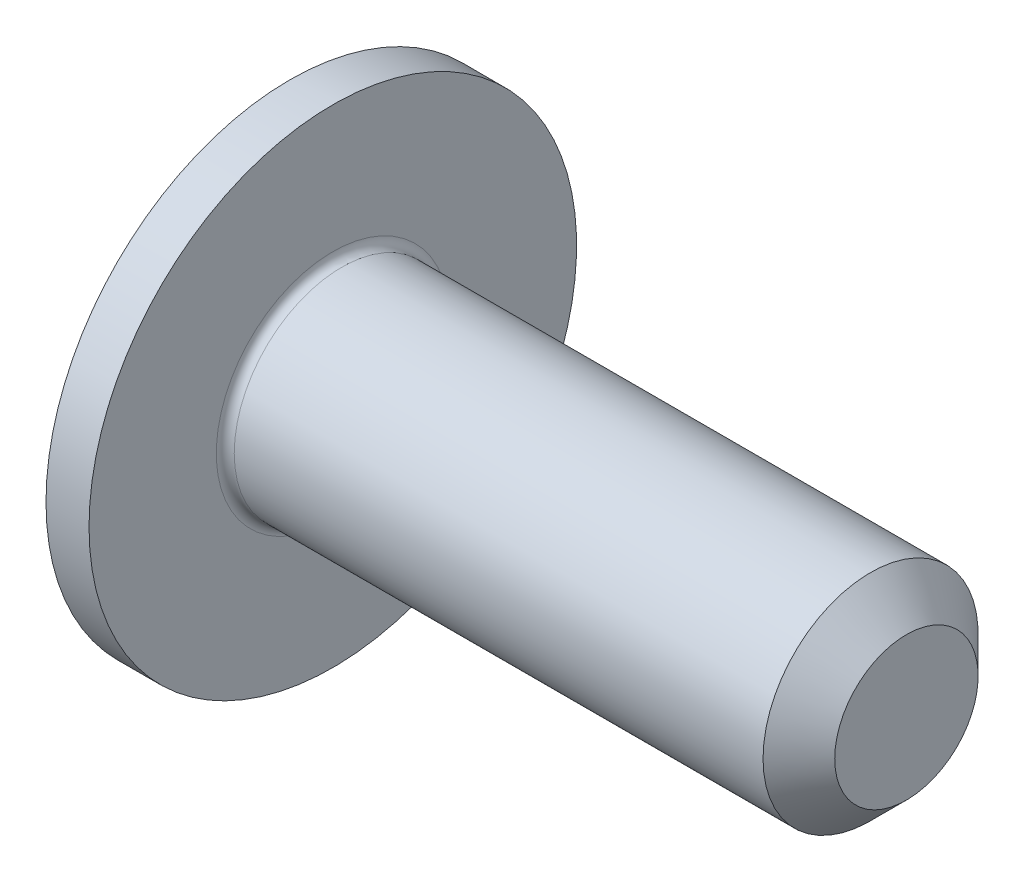
ISO-10303-21;
HEADER;
FILE_DESCRIPTION(('STEP AP214'),'2;1');
FILE_NAME('part.step','',(''),(''),'','','');
FILE_SCHEMA(('AUTOMOTIVE_DESIGN { 1 0 10303 214 1 1 1 1 }'));
ENDSEC;
DATA;
#1=APPLICATION_CONTEXT('core data for automotive mechanical design processes');
#2=APPLICATION_PROTOCOL_DEFINITION('international standard','automotive_design',2000,#1);
#3=PRODUCT_CONTEXT('',#1,'mechanical');
#4=PRODUCT('Part','Part','',(#3));
#5=PRODUCT_RELATED_PRODUCT_CATEGORY('part','',(#4));
#6=PRODUCT_DEFINITION_FORMATION('','',#4);
#7=PRODUCT_DEFINITION_CONTEXT('part definition',#1,'design');
#8=PRODUCT_DEFINITION('design','',#6,#7);
#9=PRODUCT_DEFINITION_SHAPE('','',#8);
#10=(LENGTH_UNIT() NAMED_UNIT(*) SI_UNIT(.MILLI.,.METRE.));
#11=(NAMED_UNIT(*) PLANE_ANGLE_UNIT() SI_UNIT($,.RADIAN.));
#12=(NAMED_UNIT(*) SI_UNIT($,.STERADIAN.) SOLID_ANGLE_UNIT());
#13=UNCERTAINTY_MEASURE_WITH_UNIT(LENGTH_MEASURE(1.E-05),#10,'distance_accuracy_value','');
#14=(GEOMETRIC_REPRESENTATION_CONTEXT(3) GLOBAL_UNCERTAINTY_ASSIGNED_CONTEXT((#13)) GLOBAL_UNIT_ASSIGNED_CONTEXT((#10,
#11,#12)) REPRESENTATION_CONTEXT('',''));
#15=CARTESIAN_POINT('',(0.,0.,0.));
#16=DIRECTION('',(0.,0.,1.));
#17=DIRECTION('',(1.,0.,0.));
#18=AXIS2_PLACEMENT_3D('',#15,#16,#17);
#19=CARTESIAN_POINT('',(-2.8905989232415,0.,0.));
#20=DIRECTION('',(-1.,0.,0.));
#21=DIRECTION('',(0.,-1.,0.));
#22=AXIS2_PLACEMENT_3D('',#19,#20,#21);
#23=CONICAL_SURFACE('',#22,1.9,0.78539816339745);
#24=CARTESIAN_POINT('',(-3.3,0.,0.));
#25=DIRECTION('',(1.,0.,0.));
#26=DIRECTION('',(0.,0.,-1.));
#27=AXIS2_PLACEMENT_3D('',#24,#25,#26);
#28=CIRCLE('',#27,2.30940107675851);
#29=CARTESIAN_POINT('',(-3.3,-1.15470053837925,2.));
#30=VERTEX_POINT('',#29);
#31=CARTESIAN_POINT('',(-3.3,1.15470053837925,2.));
#32=VERTEX_POINT('',#31);
#33=EDGE_CURVE('E129',#30,#32,#28,.F.);
#34=ORIENTED_EDGE('',*,*,#33,.T.);
#35=CARTESIAN_POINT('',(-4.09139546270494,-2.36958628860577,2.));
#36=CARTESIAN_POINT('',(-4.04753622473497,-2.31217995018499,2.));
#37=CARTESIAN_POINT('',(-4.00408122115932,-2.25445977428987,2.));
#38=CARTESIAN_POINT('',(-3.91816300030033,-2.13826512497911,2.));
#39=CARTESIAN_POINT('',(-3.8757000254471,-2.07979047249494,2.));
#40=CARTESIAN_POINT('',(-3.79164695493216,-1.96153258115476,2.));
#41=CARTESIAN_POINT('',(-3.75006614444884,-1.90174272081428,2.));
#42=CARTESIAN_POINT('',(-3.66838969754884,-1.78116027955478,2.));
#43=CARTESIAN_POINT('',(-3.62829395794447,-1.72036776872909,2.));
#44=CARTESIAN_POINT('',(-3.54753127039677,-1.59386851169317,2.));
#45=CARTESIAN_POINT('',(-3.50697882394963,-1.52808829237943,2.));
#46=CARTESIAN_POINT('',(-3.42844521224915,-1.39498494304244,2.));
#47=CARTESIAN_POINT('',(-3.39046451313341,-1.32766153625564,2.));
#48=CARTESIAN_POINT('',(-3.31789058124773,-1.19146840795352,2.));
#49=CARTESIAN_POINT('',(-3.28328717373968,-1.12260415104552,2.));
#50=CARTESIAN_POINT('',(-3.21823576198416,-0.98294540053103,2.));
#51=CARTESIAN_POINT('',(-3.1877863377699,-0.912151576491871,2.));
#52=CARTESIAN_POINT('',(-3.13470862693174,-0.775123898075358,2.));
#53=CARTESIAN_POINT('',(-3.11161821302263,-0.709070898878943,2.));
#54=CARTESIAN_POINT('',(-3.07072836087579,-0.57531636082436,2.));
#55=CARTESIAN_POINT('',(-3.05292926929899,-0.507614714269312,2.));
#56=CARTESIAN_POINT('',(-3.02386891779143,-0.372126099199313,2.));
#57=CARTESIAN_POINT('',(-3.01249145846734,-0.30436447489191,2.));
#58=CARTESIAN_POINT('',(-2.99650589610828,-0.168043060826933,2.));
#59=CARTESIAN_POINT('',(-2.9918964828145,-0.0994834281507621,2.));
#60=CARTESIAN_POINT('',(-2.98982099591548,0.0349465055204236,2.));
#61=CARTESIAN_POINT('',(-2.99207135666175,0.10081249405253,2.));
#62=CARTESIAN_POINT('',(-3.00294912150633,0.232011962848072,2.));
#63=CARTESIAN_POINT('',(-3.01157712076579,0.297345392837821,2.));
#64=CARTESIAN_POINT('',(-3.03487473973461,0.428114238541738,2.));
#65=CARTESIAN_POINT('',(-3.04964956795893,0.493530613367338,2.));
#66=CARTESIAN_POINT('',(-3.08443560559547,0.622925007752622,2.));
#67=CARTESIAN_POINT('',(-3.10444646376339,0.686903123481368,2.));
#68=CARTESIAN_POINT('',(-3.17413808633665,0.885397419031998,2.));
#69=CARTESIAN_POINT('',(-3.23163223537918,1.01716121743681,2.));
#70=CARTESIAN_POINT('',(-3.35953993784174,1.27453329373169,2.));
#71=CARTESIAN_POINT('',(-3.42999932548452,1.40011766460675,2.));
#72=CARTESIAN_POINT('',(-3.54000779674126,1.58164926221535,2.));
#73=CARTESIAN_POINT('',(-3.57637808227548,1.63956153116599,2.));
#74=CARTESIAN_POINT('',(-3.65066754107572,1.75439175369841,2.));
#75=CARTESIAN_POINT('',(-3.68858683090634,1.81130963198916,2.));
#76=CARTESIAN_POINT('',(-3.76538049862992,1.92382168036666,2.));
#77=CARTESIAN_POINT('',(-3.80424471276877,1.97942282256591,2.));
#78=CARTESIAN_POINT('',(-3.88301037735981,2.08986326693597,2.));
#79=CARTESIAN_POINT('',(-3.92291153911414,2.14470277476629,2.));
#80=CARTESIAN_POINT('',(-3.96323780620038,2.1992230283623,2.));
#81=B_SPLINE_CURVE_WITH_KNOTS('',3,(#35,#36,#37,#38,#39,#40,#41,#42,#43,#44,#45,#46,#47,#48,#49,
#50,#51,#52,#53,#54,#55,#56,#57,#58,#59,#60,#61,#62,#63,#64,#65,#66,#67,#68,#69,#70,#71,#72,#73,
#74,#75,#76,#77,#78,#79,#80),.UNSPECIFIED.,.F.,.F.,(4,2,2,2,2,2,2,2,2,2,2,2,2,2,2,2,2,2,2,2,2,2,
4),(0.,0.216734531943993,0.433521486450841,0.651984280142148,0.870431865722611,1.1022122830784,
1.33403459955483,1.5651354284366,1.79615706051622,2.00589271816808,2.21564211362268,
2.42146326167461,2.62724455855777,2.82463635194274,3.022046568254,3.22298450499512,
3.42390896583498,3.85394015124757,4.2855218386168,4.49066009458343,4.69581381601344,
4.89931368794884,5.10275749769567),.UNSPECIFIED.);
#82=EDGE_CURVE('E11',#32,#30,#81,.F.);
#83=ORIENTED_EDGE('',*,*,#82,.T.);
#84=EDGE_LOOP('',(#34,#83));
#85=FACE_BOUND('',#84,.T.);
#86=ADVANCED_FACE('F16',(#85),#23,.F.);
#87=CARTESIAN_POINT('',(-3.3,0.,0.));
#88=DIRECTION('',(-1.,0.,0.));
#89=DIRECTION('',(0.,-1.,0.));
#90=AXIS2_PLACEMENT_3D('',#87,#88,#89);
#91=CIRCLE('',#90,2.30940107675851);
#92=CARTESIAN_POINT('',(-3.3,-2.30940107675851,0.));
#93=VERTEX_POINT('',#92);
#94=EDGE_CURVE('E107',#93,#30,#91,.T.);
#95=ORIENTED_EDGE('',*,*,#94,.T.);
#96=CARTESIAN_POINT('',(-3.30011547871366,-1.15458506832541,2.0002));
#97=CARTESIAN_POINT('',(-3.26045309022559,-1.19427965103065,1.93144696596929));
#98=CARTESIAN_POINT('',(-3.22311998228416,-1.23463799837204,1.86154425786449));
#99=CARTESIAN_POINT('',(-3.15476368513614,-1.31693321846145,1.71900475544956));
#100=CARTESIAN_POINT('',(-3.12377853373722,-1.35887791933134,1.64635440243464));
#101=CARTESIAN_POINT('',(-3.07070021654414,-1.44345742638069,1.49985839894603));
#102=CARTESIAN_POINT('',(-3.04847362717661,-1.48607068799507,1.4260500647537));
#103=CARTESIAN_POINT('',(-3.01422881667508,-1.57223542169503,1.27680836816474));
#104=CARTESIAN_POINT('',(-3.00218502914413,-1.61578426088223,1.20137956608185));
#105=CARTESIAN_POINT('',(-2.99131851190557,-1.69083694766536,1.07138449932892));
#106=CARTESIAN_POINT('',(-2.98970975360997,-1.72224381117151,1.01698621602989));
#107=CARTESIAN_POINT('',(-2.99241887759871,-1.78500621460364,0.908278544480307));
#108=CARTESIAN_POINT('',(-2.99673883775798,-1.81636173267754,0.853969194078661));
#109=CARTESIAN_POINT('',(-3.01105956740991,-1.87877671565355,0.745863272410663));
#110=CARTESIAN_POINT('',(-3.02106669276201,-1.90983580972306,0.692067343445209));
#111=CARTESIAN_POINT('',(-3.04621243024966,-1.97141691651547,0.585405737694428));
#112=CARTESIAN_POINT('',(-3.06135064904224,-2.00193897021859,0.532539989929288));
#113=CARTESIAN_POINT('',(-3.10629450342919,-2.08012358375727,0.397120266910156));
#114=CARTESIAN_POINT('',(-3.13948883942582,-2.12730124240478,0.315406165150523));
#115=CARTESIAN_POINT('',(-3.19552582317137,-2.19667172615922,0.195252962742199));
#116=CARTESIAN_POINT('',(-3.21521470294694,-2.21953238052245,0.155657147890824));
#117=CARTESIAN_POINT('',(-3.25638731836487,-2.26483018959124,0.0771990411121278));
#118=CARTESIAN_POINT('',(-3.27786995165125,-2.28726759416161,0.0383363164062594));
#119=CARTESIAN_POINT('',(-3.30011547871366,-2.30951654681234,-0.000200000000000407));
#120=B_SPLINE_CURVE_WITH_KNOTS('',3,(#96,#97,#98,#99,#100,#101,#102,#103,#104,#105,#106,#107,
#108,#109,#110,#111,#112,#113,#114,#115,#116,#117,#118,#119),.UNSPECIFIED.,.F.,.F.,(4,2,2,2,2,2,
2,2,2,2,2,4),(0.,0.266420613771064,0.534393751523389,0.798110374376915,1.06116288956936,
1.24939906803722,1.43770123566247,1.62621426093931,1.81471283831913,2.11415604834145,
2.2634717071779,2.41269626969771),.UNSPECIFIED.);
#121=EDGE_CURVE('E30',#30,#93,#120,.T.);
#122=ORIENTED_EDGE('',*,*,#121,.T.);
#123=EDGE_LOOP('',(#95,#122));
#124=FACE_BOUND('',#123,.T.);
#125=ADVANCED_FACE('F209',(#124),#23,.F.);
#126=CARTESIAN_POINT('',(-3.3,-1.15470053837925,-2.));
#127=VERTEX_POINT('',#126);
#128=EDGE_CURVE('E128',#127,#93,#28,.F.);
#129=ORIENTED_EDGE('',*,*,#128,.T.);
#130=CARTESIAN_POINT('',(-3.30011547871366,-2.30951654681234,0.000199999999999596));
#131=CARTESIAN_POINT('',(-3.26045309022559,-2.26982196410711,-0.0685530340307072));
#132=CARTESIAN_POINT('',(-3.22311998228416,-2.22946361676572,-0.138455742135513));
#133=CARTESIAN_POINT('',(-3.15476368513615,-2.14716839667631,-0.280995244550438));
#134=CARTESIAN_POINT('',(-3.12377853373722,-2.10522369580642,-0.35364559756536));
#135=CARTESIAN_POINT('',(-3.07070021654415,-2.02064418875706,-0.500141601053974));
#136=CARTESIAN_POINT('',(-3.04847362717662,-1.97803092714269,-0.573949935246298));
#137=CARTESIAN_POINT('',(-3.01422881667508,-1.89186619344273,-0.723191631835266));
#138=CARTESIAN_POINT('',(-3.00218502914413,-1.84831735425552,-0.798620433918151));
#139=CARTESIAN_POINT('',(-2.99131851190557,-1.7732646674724,-0.928615500671079));
#140=CARTESIAN_POINT('',(-2.98970975360997,-1.74185780396625,-0.98301378397011));
#141=CARTESIAN_POINT('',(-2.99241887759872,-1.67909540053412,-1.0917214555197));
#142=CARTESIAN_POINT('',(-2.99673883775798,-1.64773988246022,-1.14603080592134));
#143=CARTESIAN_POINT('',(-3.01105956740991,-1.5853248994842,-1.25413672758934));
#144=CARTESIAN_POINT('',(-3.02106669276201,-1.55426580541469,-1.30793265655479));
#145=CARTESIAN_POINT('',(-3.04621243024966,-1.49268469862228,-1.41459426230557));
#146=CARTESIAN_POINT('',(-3.06135064904224,-1.46216264491917,-1.46746001007071));
#147=CARTESIAN_POINT('',(-3.10629450342919,-1.38397803138049,-1.60287973308984));
#148=CARTESIAN_POINT('',(-3.13948883942582,-1.33680037273297,-1.68459383484948));
#149=CARTESIAN_POINT('',(-3.19552582317137,-1.26742988897853,-1.8047470372578));
#150=CARTESIAN_POINT('',(-3.21521470294694,-1.24456923461531,-1.84434285210918));
#151=CARTESIAN_POINT('',(-3.25638731836487,-1.19927142554652,-1.92280095888787));
#152=CARTESIAN_POINT('',(-3.27786995165125,-1.17683402097615,-1.96166368359374));
#153=CARTESIAN_POINT('',(-3.30011547871366,-1.15458506832541,-2.0002));
#154=B_SPLINE_CURVE_WITH_KNOTS('',3,(#130,#131,#132,#133,#134,#135,#136,#137,#138,#139,#140,
#141,#142,#143,#144,#145,#146,#147,#148,#149,#150,#151,#152,#153),.UNSPECIFIED.,.F.,.F.,(4,2,2,
2,2,2,2,2,2,2,2,4),(0.,0.266420613771062,0.534393751523388,0.798110374376914,1.06116288956936,
1.24939906803722,1.43770123566247,1.62621426093931,1.81471283831913,2.11415604834144,
2.2634717071779,2.41269626969771),.UNSPECIFIED.);
#155=EDGE_CURVE('E178',#93,#127,#154,.T.);
#156=ORIENTED_EDGE('',*,*,#155,.T.);
#157=EDGE_LOOP('',(#129,#156));
#158=FACE_BOUND('',#157,.T.);
#159=ADVANCED_FACE('F216',(#158),#23,.F.);
#160=CARTESIAN_POINT('',(-3.3,1.15470053837925,-2.));
#161=VERTEX_POINT('',#160);
#162=EDGE_CURVE('E238',#161,#127,#28,.F.);
#163=ORIENTED_EDGE('',*,*,#162,.T.);
#164=CARTESIAN_POINT('',(-4.09139546270494,-2.36958628860577,-2.));
#165=CARTESIAN_POINT('',(-4.04753622473497,-2.31217995018499,-2.));
#166=CARTESIAN_POINT('',(-4.00408122115932,-2.25445977428987,-2.));
#167=CARTESIAN_POINT('',(-3.91816300030033,-2.13826512497911,-2.));
#168=CARTESIAN_POINT('',(-3.8757000254471,-2.07979047249494,-2.));
#169=CARTESIAN_POINT('',(-3.79164695493216,-1.96153258115476,-2.));
#170=CARTESIAN_POINT('',(-3.75006614444884,-1.90174272081428,-2.));
#171=CARTESIAN_POINT('',(-3.66838969754884,-1.78116027955478,-2.));
#172=CARTESIAN_POINT('',(-3.62829395794447,-1.72036776872909,-2.));
#173=CARTESIAN_POINT('',(-3.54753127039676,-1.59386851169317,-2.));
#174=CARTESIAN_POINT('',(-3.50697882394963,-1.52808829237943,-2.));
#175=CARTESIAN_POINT('',(-3.42844521224915,-1.39498494304244,-2.));
#176=CARTESIAN_POINT('',(-3.39046451313341,-1.32766153625564,-2.));
#177=CARTESIAN_POINT('',(-3.31789058124773,-1.19146840795352,-2.));
#178=CARTESIAN_POINT('',(-3.28328717373967,-1.12260415104552,-2.));
#179=CARTESIAN_POINT('',(-3.21823576198416,-0.982945400531028,-2.));
#180=CARTESIAN_POINT('',(-3.1877863377699,-0.912151576491869,-2.));
#181=CARTESIAN_POINT('',(-3.13470862693174,-0.775123898075356,-2.));
#182=CARTESIAN_POINT('',(-3.11161821302263,-0.709070898878941,-2.));
#183=CARTESIAN_POINT('',(-3.07072836087579,-0.575316360824358,-2.));
#184=CARTESIAN_POINT('',(-3.05292926929899,-0.507614714269311,-2.));
#185=CARTESIAN_POINT('',(-3.02386891779143,-0.372126099199312,-2.));
#186=CARTESIAN_POINT('',(-3.01249145846734,-0.304364474891909,-2.));
#187=CARTESIAN_POINT('',(-2.99650589610828,-0.168043060826932,-2.));
#188=CARTESIAN_POINT('',(-2.9918964828145,-0.0994834281507614,-2.));
#189=CARTESIAN_POINT('',(-2.98982099591548,0.0349465055204243,-2.));
#190=CARTESIAN_POINT('',(-2.99207135666175,0.100812494052531,-2.));
#191=CARTESIAN_POINT('',(-3.00294912150633,0.232011962848073,-2.));
#192=CARTESIAN_POINT('',(-3.01157712076579,0.297345392837822,-2.));
#193=CARTESIAN_POINT('',(-3.03487473973461,0.428114238541739,-2.));
#194=CARTESIAN_POINT('',(-3.04964956795893,0.493530613367338,-2.));
#195=CARTESIAN_POINT('',(-3.08443560559547,0.622925007752622,-2.));
#196=CARTESIAN_POINT('',(-3.10444646376339,0.686903123481368,-2.));
#197=CARTESIAN_POINT('',(-3.17413808633665,0.885397419031998,-2.));
#198=CARTESIAN_POINT('',(-3.23163223537918,1.01716121743681,-2.));
#199=CARTESIAN_POINT('',(-3.35953993784174,1.27453329373169,-2.));
#200=CARTESIAN_POINT('',(-3.42999932548452,1.40011766460675,-2.));
#201=CARTESIAN_POINT('',(-3.54000779674126,1.58164926221535,-2.));
#202=CARTESIAN_POINT('',(-3.57637808227548,1.63956153116599,-2.));
#203=CARTESIAN_POINT('',(-3.65066754107572,1.75439175369842,-2.));
#204=CARTESIAN_POINT('',(-3.68858683090634,1.81130963198916,-2.));
#205=CARTESIAN_POINT('',(-3.76538049862992,1.92382168036666,-2.));
#206=CARTESIAN_POINT('',(-3.80424471276877,1.97942282256591,-2.));
#207=CARTESIAN_POINT('',(-3.88301037735981,2.08986326693597,-2.));
#208=CARTESIAN_POINT('',(-3.92291153911414,2.14470277476629,-2.));
#209=CARTESIAN_POINT('',(-3.96323780620038,2.1992230283623,-2.));
#210=B_SPLINE_CURVE_WITH_KNOTS('',3,(#164,#165,#166,#167,#168,#169,#170,#171,#172,#173,#174,
#175,#176,#177,#178,#179,#180,#181,#182,#183,#184,#185,#186,#187,#188,#189,#190,#191,#192,#193,
#194,#195,#196,#197,#198,#199,#200,#201,#202,#203,#204,#205,#206,#207,#208,#209),.UNSPECIFIED.,
.F.,.F.,(4,2,2,2,2,2,2,2,2,2,2,2,2,2,2,2,2,2,2,2,2,2,4),(0.,0.216734531943993,0.433521486450841,
0.651984280142147,0.870431865722611,1.1022122830784,1.33403459955483,1.5651354284366,
1.79615706051622,2.00589271816808,2.21564211362268,2.42146326167461,2.62724455855777,
2.82463635194274,3.022046568254,3.22298450499512,3.42390896583498,3.85394015124757,
4.2855218386168,4.49066009458343,4.69581381601344,4.89931368794883,5.10275749769567),.UNSPECIFIED.);
#211=EDGE_CURVE('E171',#127,#161,#210,.T.);
#212=ORIENTED_EDGE('',*,*,#211,.T.);
#213=EDGE_LOOP('',(#163,#212));
#214=FACE_BOUND('',#213,.T.);
#215=ADVANCED_FACE('F230',(#214),#23,.F.);
#216=CARTESIAN_POINT('',(-3.3,2.30940107675851,0.));
#217=VERTEX_POINT('',#216);
#218=EDGE_CURVE('E236',#217,#161,#28,.F.);
#219=ORIENTED_EDGE('',*,*,#218,.T.);
#220=CARTESIAN_POINT('',(-3.30011547871366,1.15458506832541,-2.0002));
#221=CARTESIAN_POINT('',(-3.26045309022559,1.19427965103065,-1.93144696596929));
#222=CARTESIAN_POINT('',(-3.22311998228416,1.23463799837204,-1.86154425786449));
#223=CARTESIAN_POINT('',(-3.15476368513615,1.31693321846145,-1.71900475544956));
#224=CARTESIAN_POINT('',(-3.12377853373722,1.35887791933134,-1.64635440243464));
#225=CARTESIAN_POINT('',(-3.07070021654414,1.44345742638069,-1.49985839894603));
#226=CARTESIAN_POINT('',(-3.04847362717661,1.48607068799507,-1.4260500647537));
#227=CARTESIAN_POINT('',(-3.01422881667508,1.57223542169503,-1.27680836816473));
#228=CARTESIAN_POINT('',(-3.00218502914414,1.61578426088223,-1.20137956608185));
#229=CARTESIAN_POINT('',(-2.99131851190557,1.69083694766536,-1.07138449932892));
#230=CARTESIAN_POINT('',(-2.98970975360997,1.72224381117151,-1.01698621602989));
#231=CARTESIAN_POINT('',(-2.99241887759871,1.78500621460364,-0.908278544480306));
#232=CARTESIAN_POINT('',(-2.99673883775798,1.81636173267754,-0.853969194078661));
#233=CARTESIAN_POINT('',(-3.01105956740991,1.87877671565355,-0.745863272410663));
#234=CARTESIAN_POINT('',(-3.02106669276201,1.90983580972306,-0.692067343445209));
#235=CARTESIAN_POINT('',(-3.04621243024966,1.97141691651547,-0.585405737694428));
#236=CARTESIAN_POINT('',(-3.06135064904224,2.00193897021859,-0.532539989929288));
#237=CARTESIAN_POINT('',(-3.10629450342919,2.08012358375727,-0.397120266910156));
#238=CARTESIAN_POINT('',(-3.13948883942582,2.12730124240478,-0.315406165150523));
#239=CARTESIAN_POINT('',(-3.19552582317137,2.19667172615922,-0.195252962742199));
#240=CARTESIAN_POINT('',(-3.21521470294694,2.21953238052245,-0.155657147890824));
#241=CARTESIAN_POINT('',(-3.25638731836487,2.26483018959123,-0.0771990411121282));
#242=CARTESIAN_POINT('',(-3.27786995165125,2.28726759416161,-0.0383363164062597));
#243=CARTESIAN_POINT('',(-3.30011547871366,2.30951654681234,0.000200000000000379));
#244=B_SPLINE_CURVE_WITH_KNOTS('',3,(#220,#221,#222,#223,#224,#225,#226,#227,#228,#229,#230,
#231,#232,#233,#234,#235,#236,#237,#238,#239,#240,#241,#242,#243),.UNSPECIFIED.,.F.,.F.,(4,2,2,
2,2,2,2,2,2,2,2,4),(0.,0.266420613771063,0.534393751523388,0.798110374376915,1.06116288956936,
1.24939906803722,1.43770123566247,1.62621426093931,1.81471283831913,2.11415604834144,
2.2634717071779,2.41269626969771),.UNSPECIFIED.);
#245=EDGE_CURVE('E144',#161,#217,#244,.T.);
#246=ORIENTED_EDGE('',*,*,#245,.T.);
#247=EDGE_LOOP('',(#219,#246));
#248=FACE_BOUND('',#247,.T.);
#249=ADVANCED_FACE('F220',(#248),#23,.F.);
#250=EDGE_CURVE('E133',#32,#217,#28,.F.);
#251=ORIENTED_EDGE('',*,*,#250,.T.);
#252=CARTESIAN_POINT('',(-3.30011547871366,2.30951654681234,-0.000199999999999596));
#253=CARTESIAN_POINT('',(-3.26045309022559,2.26982196410711,0.0685530340307071));
#254=CARTESIAN_POINT('',(-3.22311998228416,2.22946361676572,0.138455742135513));
#255=CARTESIAN_POINT('',(-3.15476368513615,2.14716839667631,0.280995244550438));
#256=CARTESIAN_POINT('',(-3.12377853373722,2.10522369580642,0.35364559756536));
#257=CARTESIAN_POINT('',(-3.07070021654415,2.02064418875706,0.500141601053973));
#258=CARTESIAN_POINT('',(-3.04847362717661,1.97803092714269,0.573949935246297));
#259=CARTESIAN_POINT('',(-3.01422881667508,1.89186619344273,0.723191631835265));
#260=CARTESIAN_POINT('',(-3.00218502914414,1.84831735425552,0.798620433918151));
#261=CARTESIAN_POINT('',(-2.99131851190557,1.7732646674724,0.928615500671079));
#262=CARTESIAN_POINT('',(-2.98970975360997,1.74185780396625,0.98301378397011));
#263=CARTESIAN_POINT('',(-2.99241887759872,1.67909540053412,1.0917214555197));
#264=CARTESIAN_POINT('',(-2.99673883775798,1.64773988246022,1.14603080592134));
#265=CARTESIAN_POINT('',(-3.01105956740991,1.5853248994842,1.25413672758934));
#266=CARTESIAN_POINT('',(-3.02106669276201,1.55426580541469,1.30793265655479));
#267=CARTESIAN_POINT('',(-3.04621243024966,1.49268469862228,1.41459426230557));
#268=CARTESIAN_POINT('',(-3.06135064904224,1.46216264491917,1.46746001007071));
#269=CARTESIAN_POINT('',(-3.10629450342919,1.38397803138048,1.60287973308984));
#270=CARTESIAN_POINT('',(-3.13948883942582,1.33680037273297,1.68459383484948));
#271=CARTESIAN_POINT('',(-3.19552582317137,1.26742988897853,1.8047470372578));
#272=CARTESIAN_POINT('',(-3.21521470294694,1.24456923461531,1.84434285210918));
#273=CARTESIAN_POINT('',(-3.25638731836487,1.19927142554652,1.92280095888787));
#274=CARTESIAN_POINT('',(-3.27786995165125,1.17683402097614,1.96166368359374));
#275=CARTESIAN_POINT('',(-3.30011547871366,1.15458506832541,2.0002));
#276=B_SPLINE_CURVE_WITH_KNOTS('',3,(#252,#253,#254,#255,#256,#257,#258,#259,#260,#261,#262,
#263,#264,#265,#266,#267,#268,#269,#270,#271,#272,#273,#274,#275),.UNSPECIFIED.,.F.,.F.,(4,2,2,
2,2,2,2,2,2,2,2,4),(0.,0.266420613771062,0.534393751523386,0.798110374376913,1.06116288956936,
1.24939906803721,1.43770123566247,1.62621426093931,1.81471283831913,2.11415604834144,
2.2634717071779,2.41269626969771),.UNSPECIFIED.);
#277=EDGE_CURVE('E136',#217,#32,#276,.T.);
#278=ORIENTED_EDGE('',*,*,#277,.T.);
#279=EDGE_LOOP('',(#251,#278));
#280=FACE_BOUND('',#279,.T.);
#281=ADVANCED_FACE('F211',(#280),#23,.F.);
#282=CARTESIAN_POINT('',(0.,0.,3.));
#283=DIRECTION('',(-1.,0.,0.));
#284=DIRECTION('',(0.,0.,1.));
#285=AXIS2_PLACEMENT_3D('',#282,#283,#284);
#286=PLANE('',#285);
#287=CARTESIAN_POINT('',(0.,0.,0.));
#288=DIRECTION('',(-1.,0.,0.));
#289=DIRECTION('',(0.,0.,1.));
#290=AXIS2_PLACEMENT_3D('',#287,#288,#289);
#291=CIRCLE('',#290,6.8);
#292=CARTESIAN_POINT('',(0.,0.,6.8));
#293=VERTEX_POINT('',#292);
#294=EDGE_CURVE('E113',#293,#293,#291,.T.);
#295=ORIENTED_EDGE('',*,*,#294,.F.);
#296=EDGE_LOOP('',(#295));
#297=FACE_BOUND('',#296,.T.);
#298=CARTESIAN_POINT('',(0.,0.,0.));
#299=DIRECTION('',(1.,0.,0.));
#300=DIRECTION('',(0.,0.,-1.));
#301=AXIS2_PLACEMENT_3D('',#298,#299,#300);
#302=CIRCLE('',#301,3.25);
#303=CARTESIAN_POINT('',(0.,0.,-3.25));
#304=VERTEX_POINT('',#303);
#305=EDGE_CURVE('E132',#304,#304,#302,.T.);
#306=ORIENTED_EDGE('',*,*,#305,.F.);
#307=EDGE_LOOP('',(#306));
#308=FACE_BOUND('',#307,.T.);
#309=ADVANCED_FACE('F219',(#297,#308),#286,.F.);
#310=CARTESIAN_POINT('',(-3.3,0.,0.));
#311=DIRECTION('',(-1.,0.,0.));
#312=DIRECTION('',(0.,0.,1.));
#313=AXIS2_PLACEMENT_3D('',#310,#311,#312);
#314=CYLINDRICAL_SURFACE('',#313,6.8);
#315=ORIENTED_EDGE('',*,*,#294,.T.);
#316=EDGE_LOOP('',(#315));
#317=FACE_BOUND('',#316,.T.);
#318=CARTESIAN_POINT('',(-1.2,0.,0.));
#319=DIRECTION('',(1.,0.,0.));
#320=DIRECTION('',(0.,0.,-1.));
#321=AXIS2_PLACEMENT_3D('',#318,#319,#320);
#322=CIRCLE('',#321,6.8);
#323=CARTESIAN_POINT('',(-1.2,0.,-6.8));
#324=VERTEX_POINT('',#323);
#325=EDGE_CURVE('E125',#324,#324,#322,.T.);
#326=ORIENTED_EDGE('',*,*,#325,.T.);
#327=EDGE_LOOP('',(#326));
#328=FACE_BOUND('',#327,.T.);
#329=ADVANCED_FACE('F227',(#317,#328),#314,.T.);
#330=CARTESIAN_POINT('',(1.95917952904033,0.,0.));
#331=DIRECTION('',(1.,0.,0.));
#332=DIRECTION('',(0.,0.,-1.));
#333=AXIS2_PLACEMENT_3D('',#330,#331,#332);
#334=DEGENERATE_TOROIDAL_SURFACE('',#333,0.476193699635303,5.6,.T.);
#335=CARTESIAN_POINT('',(-3.3,0.,0.));
#336=DIRECTION('',(1.,0.,0.));
#337=DIRECTION('',(0.,0.,-1.));
#338=AXIS2_PLACEMENT_3D('',#335,#336,#337);
#339=CIRCLE('',#338,2.4);
#340=CARTESIAN_POINT('',(-3.3,0.,-2.4));
#341=VERTEX_POINT('',#340);
#342=EDGE_CURVE('E122',#341,#341,#339,.T.);
#343=ORIENTED_EDGE('',*,*,#342,.T.);
#344=EDGE_LOOP('',(#343));
#345=FACE_BOUND('',#344,.T.);
#346=CARTESIAN_POINT('',(-1.2,0.,0.));
#347=DIRECTION('',(1.,0.,0.));
#348=DIRECTION('',(0.,0.,-1.));
#349=AXIS2_PLACEMENT_3D('',#346,#347,#348);
#350=CIRCLE('',#349,5.1);
#351=CARTESIAN_POINT('',(-1.2,0.,-5.1));
#352=VERTEX_POINT('',#351);
#353=EDGE_CURVE('E110',#352,#352,#350,.T.);
#354=ORIENTED_EDGE('',*,*,#353,.F.);
#355=EDGE_LOOP('',(#354));
#356=FACE_BOUND('',#355,.T.);
#357=ADVANCED_FACE('F253',(#345,#356),#334,.T.);
#358=CARTESIAN_POINT('',(-1.2,5.1,0.));
#359=DIRECTION('',(1.,0.,0.));
#360=DIRECTION('',(0.,0.,-1.));
#361=AXIS2_PLACEMENT_3D('',#358,#359,#360);
#362=PLANE('',#361);
#363=ORIENTED_EDGE('',*,*,#325,.F.);
#364=EDGE_LOOP('',(#363));
#365=FACE_BOUND('',#364,.T.);
#366=ORIENTED_EDGE('',*,*,#353,.T.);
#367=EDGE_LOOP('',(#366));
#368=FACE_BOUND('',#367,.T.);
#369=ADVANCED_FACE('F249',(#365,#368),#362,.F.);
#370=CARTESIAN_POINT('',(-3.3,0.,6.8));
#371=DIRECTION('',(1.,0.,0.));
#372=DIRECTION('',(0.,0.,-1.));
#373=AXIS2_PLACEMENT_3D('',#370,#371,#372);
#374=PLANE('',#373);
#375=ORIENTED_EDGE('',*,*,#33,.F.);
#376=ORIENTED_EDGE('',*,*,#94,.F.);
#377=ORIENTED_EDGE('',*,*,#128,.F.);
#378=ORIENTED_EDGE('',*,*,#162,.F.);
#379=ORIENTED_EDGE('',*,*,#218,.F.);
#380=ORIENTED_EDGE('',*,*,#250,.F.);
#381=EDGE_LOOP('',(#375,#376,#377,#378,#379,#380));
#382=FACE_BOUND('',#381,.T.);
#383=ORIENTED_EDGE('',*,*,#342,.F.);
#384=EDGE_LOOP('',(#383));
#385=FACE_BOUND('',#384,.T.);
#386=ADVANCED_FACE('F196',(#382,#385),#374,.F.);
#387=CARTESIAN_POINT('',(0.25,0.,0.));
#388=DIRECTION('',(1.,0.,0.));
#389=DIRECTION('',(0.,0.,-1.));
#390=AXIS2_PLACEMENT_3D('',#387,#388,#389);
#391=TOROIDAL_SURFACE('',#390,3.25,0.25);
#392=CARTESIAN_POINT('',(0.25,0.,0.));
#393=DIRECTION('',(1.,0.,0.));
#394=DIRECTION('',(0.,0.,-1.));
#395=AXIS2_PLACEMENT_3D('',#392,#393,#394);
#396=CIRCLE('',#395,3.);
#397=CARTESIAN_POINT('',(0.25,0.,-3.));
#398=VERTEX_POINT('',#397);
#399=EDGE_CURVE('E99',#398,#398,#396,.T.);
#400=ORIENTED_EDGE('',*,*,#399,.F.);
#401=EDGE_LOOP('',(#400));
#402=FACE_BOUND('',#401,.T.);
#403=ORIENTED_EDGE('',*,*,#305,.T.);
#404=EDGE_LOOP('',(#403));
#405=FACE_BOUND('',#404,.T.);
#406=ADVANCED_FACE('F194',(#402,#405),#391,.F.);
#407=CARTESIAN_POINT('',(16.,0.,0.));
#408=DIRECTION('',(-1.,0.,0.));
#409=DIRECTION('',(0.,0.,1.));
#410=AXIS2_PLACEMENT_3D('',#407,#408,#409);
#411=PLANE('',#410);
#412=CARTESIAN_POINT('',(16.,0.,0.));
#413=DIRECTION('',(-1.,0.,0.));
#414=DIRECTION('',(0.,0.,1.));
#415=AXIS2_PLACEMENT_3D('',#412,#413,#414);
#416=CIRCLE('',#415,2.);
#417=CARTESIAN_POINT('',(16.,0.,2.));
#418=VERTEX_POINT('',#417);
#419=EDGE_CURVE('E119',#418,#418,#416,.T.);
#420=ORIENTED_EDGE('',*,*,#419,.F.);
#421=EDGE_LOOP('',(#420));
#422=FACE_BOUND('',#421,.T.);
#423=ADVANCED_FACE('F18',(#422),#411,.F.);
#424=CARTESIAN_POINT('',(16.,0.,0.));
#425=DIRECTION('',(-1.,0.,0.));
#426=DIRECTION('',(0.,0.,1.));
#427=AXIS2_PLACEMENT_3D('',#424,#425,#426);
#428=CONICAL_SURFACE('',#427,2.,0.785398163397448);
#429=CARTESIAN_POINT('',(15.,0.,0.));
#430=DIRECTION('',(-1.,0.,0.));
#431=DIRECTION('',(0.,0.,1.));
#432=AXIS2_PLACEMENT_3D('',#429,#430,#431);
#433=CIRCLE('',#432,3.);
#434=CARTESIAN_POINT('',(15.,0.,3.));
#435=VERTEX_POINT('',#434);
#436=EDGE_CURVE('E116',#435,#435,#433,.T.);
#437=ORIENTED_EDGE('',*,*,#436,.F.);
#438=EDGE_LOOP('',(#437));
#439=FACE_BOUND('',#438,.T.);
#440=ORIENTED_EDGE('',*,*,#419,.T.);
#441=EDGE_LOOP('',(#440));
#442=FACE_BOUND('',#441,.T.);
#443=ADVANCED_FACE('F270',(#439,#442),#428,.T.);
#444=CARTESIAN_POINT('',(-3.3,0.,0.));
#445=DIRECTION('',(-1.,0.,0.));
#446=DIRECTION('',(0.,0.,1.));
#447=AXIS2_PLACEMENT_3D('',#444,#445,#446);
#448=CYLINDRICAL_SURFACE('',#447,3.);
#449=ORIENTED_EDGE('',*,*,#399,.T.);
#450=EDGE_LOOP('',(#449));
#451=FACE_BOUND('',#450,.T.);
#452=ORIENTED_EDGE('',*,*,#436,.T.);
#453=EDGE_LOOP('',(#452));
#454=FACE_BOUND('',#453,.T.);
#455=ADVANCED_FACE('F193',(#451,#454),#448,.T.);
#456=CARTESIAN_POINT('',(-1.2,1.15470053837925,2.));
#457=DIRECTION('',(0.,0.,-1.));
#458=DIRECTION('',(-1.,0.,0.));
#459=AXIS2_PLACEMENT_3D('',#456,#457,#458);
#460=PLANE('',#459);
#461=DIRECTION('',(-1.,0.,0.));
#462=VECTOR('',#461,1.);
#463=CARTESIAN_POINT('',(-1.2,1.15470053837925,2.));
#464=LINE('',#463,#462);
#465=CARTESIAN_POINT('',(-1.2,1.15470053837925,2.));
#466=VERTEX_POINT('',#465);
#467=EDGE_CURVE('E37',#466,#32,#464,.T.);
#468=ORIENTED_EDGE('',*,*,#467,.F.);
#469=DIRECTION('',(0.,-1.,0.));
#470=VECTOR('',#469,1.);
#471=CARTESIAN_POINT('',(-1.2,1.15470053837925,2.));
#472=LINE('',#471,#470);
#473=CARTESIAN_POINT('',(-1.2,-1.15470053837925,2.));
#474=VERTEX_POINT('',#473);
#475=EDGE_CURVE('E79',#466,#474,#472,.T.);
#476=ORIENTED_EDGE('',*,*,#475,.T.);
#477=DIRECTION('',(-1.,0.,0.));
#478=VECTOR('',#477,1.);
#479=CARTESIAN_POINT('',(-1.2,-1.15470053837925,2.));
#480=LINE('',#479,#478);
#481=EDGE_CURVE('E90',#474,#30,#480,.T.);
#482=ORIENTED_EDGE('',*,*,#481,.T.);
#483=ORIENTED_EDGE('',*,*,#82,.F.);
#484=EDGE_LOOP('',(#468,#476,#482,#483));
#485=FACE_BOUND('',#484,.T.);
#486=ADVANCED_FACE('F89',(#485),#460,.T.);
#487=CARTESIAN_POINT('',(-1.2,-1.15470053837925,2.));
#488=DIRECTION('',(0.,0.866025403784439,-0.5));
#489=DIRECTION('',(0.,0.5,0.866025403784439));
#490=AXIS2_PLACEMENT_3D('',#487,#488,#489);
#491=PLANE('',#490);
#492=ORIENTED_EDGE('',*,*,#481,.F.);
#493=DIRECTION('',(0.,-0.5,-0.866025403784439));
#494=VECTOR('',#493,1.);
#495=CARTESIAN_POINT('',(-1.2,-1.15470053837925,2.));
#496=LINE('',#495,#494);
#497=CARTESIAN_POINT('',(-1.2,-2.30940107675851,0.));
#498=VERTEX_POINT('',#497);
#499=EDGE_CURVE('E75',#474,#498,#496,.T.);
#500=ORIENTED_EDGE('',*,*,#499,.T.);
#501=DIRECTION('',(-1.,0.,0.));
#502=VECTOR('',#501,1.);
#503=CARTESIAN_POINT('',(-1.2,-2.30940107675851,0.));
#504=LINE('',#503,#502);
#505=EDGE_CURVE('E96',#498,#93,#504,.T.);
#506=ORIENTED_EDGE('',*,*,#505,.T.);
#507=ORIENTED_EDGE('',*,*,#121,.F.);
#508=EDGE_LOOP('',(#492,#500,#506,#507));
#509=FACE_BOUND('',#508,.T.);
#510=ADVANCED_FACE('F93',(#509),#491,.T.);
#511=CARTESIAN_POINT('',(-1.2,-2.30940107675851,0.));
#512=DIRECTION('',(0.,0.866025403784439,0.5));
#513=DIRECTION('',(0.,-0.5,0.866025403784439));
#514=AXIS2_PLACEMENT_3D('',#511,#512,#513);
#515=PLANE('',#514);
#516=ORIENTED_EDGE('',*,*,#505,.F.);
#517=DIRECTION('',(0.,0.5,-0.866025403784439));
#518=VECTOR('',#517,1.);
#519=CARTESIAN_POINT('',(-1.2,-2.30940107675851,0.));
#520=LINE('',#519,#518);
#521=CARTESIAN_POINT('',(-1.2,-1.15470053837925,-2.));
#522=VERTEX_POINT('',#521);
#523=EDGE_CURVE('E81',#498,#522,#520,.T.);
#524=ORIENTED_EDGE('',*,*,#523,.T.);
#525=DIRECTION('',(-1.,0.,0.));
#526=VECTOR('',#525,1.);
#527=CARTESIAN_POINT('',(-1.2,-1.15470053837925,-2.));
#528=LINE('',#527,#526);
#529=EDGE_CURVE('E101',#522,#127,#528,.T.);
#530=ORIENTED_EDGE('',*,*,#529,.T.);
#531=ORIENTED_EDGE('',*,*,#155,.F.);
#532=EDGE_LOOP('',(#516,#524,#530,#531));
#533=FACE_BOUND('',#532,.T.);
#534=ADVANCED_FACE('F167',(#533),#515,.T.);
#535=CARTESIAN_POINT('',(-1.2,-1.15470053837925,-2.));
#536=DIRECTION('',(0.,0.,1.));
#537=DIRECTION('',(1.,0.,0.));
#538=AXIS2_PLACEMENT_3D('',#535,#536,#537);
#539=PLANE('',#538);
#540=ORIENTED_EDGE('',*,*,#529,.F.);
#541=DIRECTION('',(0.,1.,0.));
#542=VECTOR('',#541,1.);
#543=CARTESIAN_POINT('',(-1.2,-1.15470053837925,-2.));
#544=LINE('',#543,#542);
#545=CARTESIAN_POINT('',(-1.2,1.15470053837925,-2.));
#546=VERTEX_POINT('',#545);
#547=EDGE_CURVE('E480',#522,#546,#544,.T.);
#548=ORIENTED_EDGE('',*,*,#547,.T.);
#549=DIRECTION('',(-1.,0.,0.));
#550=VECTOR('',#549,1.);
#551=CARTESIAN_POINT('',(-1.2,1.15470053837925,-2.));
#552=LINE('',#551,#550);
#553=EDGE_CURVE('E468',#546,#161,#552,.T.);
#554=ORIENTED_EDGE('',*,*,#553,.T.);
#555=ORIENTED_EDGE('',*,*,#211,.F.);
#556=EDGE_LOOP('',(#540,#548,#554,#555));
#557=FACE_BOUND('',#556,.T.);
#558=ADVANCED_FACE('F162',(#557),#539,.T.);
#559=CARTESIAN_POINT('',(-1.2,1.15470053837925,-2.));
#560=DIRECTION('',(0.,-0.866025403784439,0.5));
#561=DIRECTION('',(0.,-0.5,-0.866025403784439));
#562=AXIS2_PLACEMENT_3D('',#559,#560,#561);
#563=PLANE('',#562);
#564=ORIENTED_EDGE('',*,*,#553,.F.);
#565=DIRECTION('',(0.,0.5,0.866025403784439));
#566=VECTOR('',#565,1.);
#567=CARTESIAN_POINT('',(-1.2,1.15470053837925,-2.));
#568=LINE('',#567,#566);
#569=CARTESIAN_POINT('',(-1.2,2.30940107675851,0.));
#570=VERTEX_POINT('',#569);
#571=EDGE_CURVE('E478',#546,#570,#568,.T.);
#572=ORIENTED_EDGE('',*,*,#571,.T.);
#573=DIRECTION('',(-1.,0.,0.));
#574=VECTOR('',#573,1.);
#575=CARTESIAN_POINT('',(-1.2,2.30940107675851,0.));
#576=LINE('',#575,#574);
#577=EDGE_CURVE('E470',#570,#217,#576,.T.);
#578=ORIENTED_EDGE('',*,*,#577,.T.);
#579=ORIENTED_EDGE('',*,*,#245,.F.);
#580=EDGE_LOOP('',(#564,#572,#578,#579));
#581=FACE_BOUND('',#580,.T.);
#582=ADVANCED_FACE('F158',(#581),#563,.T.);
#583=CARTESIAN_POINT('',(-1.2,2.30940107675851,0.));
#584=DIRECTION('',(0.,-0.866025403784439,-0.5));
#585=DIRECTION('',(0.,0.5,-0.866025403784439));
#586=AXIS2_PLACEMENT_3D('',#583,#584,#585);
#587=PLANE('',#586);
#588=ORIENTED_EDGE('',*,*,#577,.F.);
#589=DIRECTION('',(0.,-0.5,0.866025403784439));
#590=VECTOR('',#589,1.);
#591=CARTESIAN_POINT('',(-1.2,2.30940107675851,0.));
#592=LINE('',#591,#590);
#593=EDGE_CURVE('E476',#570,#466,#592,.T.);
#594=ORIENTED_EDGE('',*,*,#593,.T.);
#595=ORIENTED_EDGE('',*,*,#467,.T.);
#596=ORIENTED_EDGE('',*,*,#277,.F.);
#597=EDGE_LOOP('',(#588,#594,#595,#596));
#598=FACE_BOUND('',#597,.T.);
#599=ADVANCED_FACE('F154',(#598),#587,.T.);
#600=CARTESIAN_POINT('',(-1.2,0.,0.));
#601=DIRECTION('',(1.,0.,0.));
#602=DIRECTION('',(0.,0.,-1.));
#603=AXIS2_PLACEMENT_3D('',#600,#601,#602);
#604=PLANE('',#603);
#605=CARTESIAN_POINT('',(-1.2,0.,0.));
#606=DIRECTION('',(1.,0.,0.));
#607=DIRECTION('',(0.,0.,-1.));
#608=AXIS2_PLACEMENT_3D('',#605,#606,#607);
#609=CIRCLE('',#608,1.9);
#610=CARTESIAN_POINT('',(-1.2,0.,-1.9));
#611=VERTEX_POINT('',#610);
#612=EDGE_CURVE('E95',#611,#611,#609,.T.);
#613=ORIENTED_EDGE('',*,*,#612,.T.);
#614=EDGE_LOOP('',(#613));
#615=FACE_BOUND('',#614,.T.);
#616=ORIENTED_EDGE('',*,*,#475,.F.);
#617=ORIENTED_EDGE('',*,*,#593,.F.);
#618=ORIENTED_EDGE('',*,*,#571,.F.);
#619=ORIENTED_EDGE('',*,*,#547,.F.);
#620=ORIENTED_EDGE('',*,*,#523,.F.);
#621=ORIENTED_EDGE('',*,*,#499,.F.);
#622=EDGE_LOOP('',(#616,#617,#618,#619,#620,#621));
#623=FACE_BOUND('',#622,.T.);
#624=ADVANCED_FACE('F77',(#615,#623),#604,.F.);
#625=CARTESIAN_POINT('',(-0.103034488539713,0.,0.));
#626=DIRECTION('',(-1.,0.,0.));
#627=DIRECTION('',(0.,-1.,0.));
#628=AXIS2_PLACEMENT_3D('',#625,#626,#627);
#629=CONICAL_SURFACE('',#628,0.,1.0471975511966);
#630=ORIENTED_EDGE('',*,*,#612,.F.);
#631=EDGE_LOOP('',(#630));
#632=FACE_BOUND('',#631,.T.);
#633=CARTESIAN_POINT('',(-0.103034488539713,0.,0.));
#634=VERTEX_POINT('',#633);
#635=VERTEX_LOOP('',#634);
#636=FACE_BOUND('',#635,.T.);
#637=ADVANCED_FACE('F198',(#632,#636),#629,.F.);
#638=CLOSED_SHELL('',(#86,#125,#159,#215,#249,#281,#309,#329,#357,#369,#386,#406,#423,#443,#455,
#486,#510,#534,#558,#582,#599,#624,#637));
#639=MANIFOLD_SOLID_BREP('B1',#638);
#640=ADVANCED_BREP_SHAPE_REPRESENTATION('',(#18,#639),#14);
#641=SHAPE_DEFINITION_REPRESENTATION(#9,#640);
ENDSEC;
END-ISO-10303-21;
